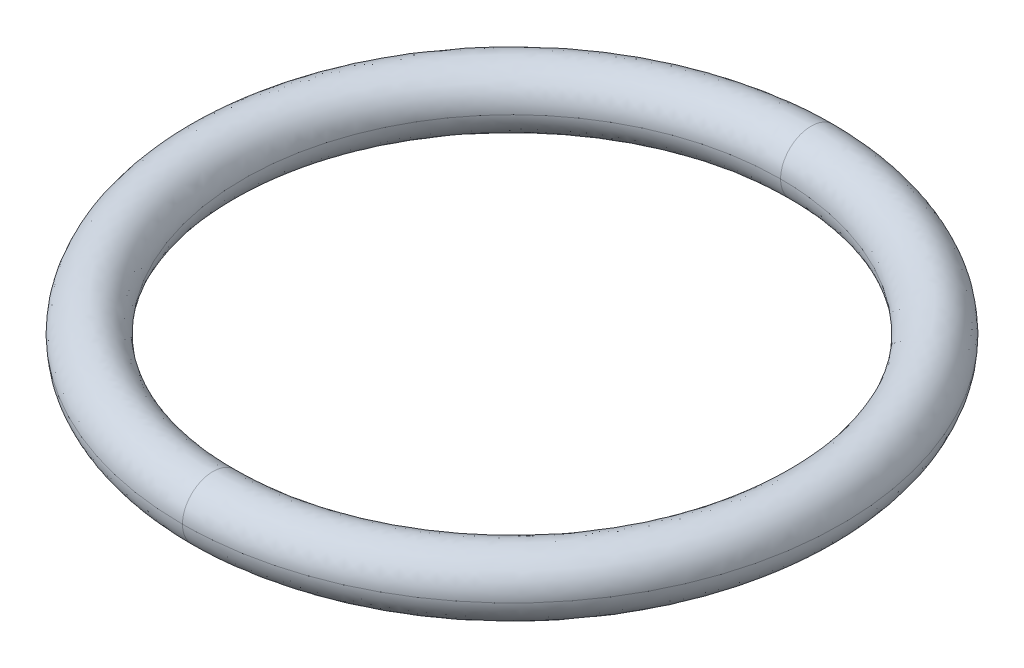
ISO-10303-21;
HEADER;
FILE_DESCRIPTION(('STEP AP214'),'2;1');
FILE_NAME('part.step','',(''),(''),'','','');
FILE_SCHEMA(('AUTOMOTIVE_DESIGN { 1 0 10303 214 1 1 1 1 }'));
ENDSEC;
DATA;
#1=APPLICATION_CONTEXT('core data for automotive mechanical design processes');
#2=APPLICATION_PROTOCOL_DEFINITION('international standard','automotive_design',2000,#1);
#3=PRODUCT_CONTEXT('',#1,'mechanical');
#4=PRODUCT('Part','Part','',(#3));
#5=PRODUCT_RELATED_PRODUCT_CATEGORY('part','',(#4));
#6=PRODUCT_DEFINITION_FORMATION('','',#4);
#7=PRODUCT_DEFINITION_CONTEXT('part definition',#1,'design');
#8=PRODUCT_DEFINITION('design','',#6,#7);
#9=PRODUCT_DEFINITION_SHAPE('','',#8);
#10=(LENGTH_UNIT() NAMED_UNIT(*) SI_UNIT(.MILLI.,.METRE.));
#11=(NAMED_UNIT(*) PLANE_ANGLE_UNIT() SI_UNIT($,.RADIAN.));
#12=(NAMED_UNIT(*) SI_UNIT($,.STERADIAN.) SOLID_ANGLE_UNIT());
#13=UNCERTAINTY_MEASURE_WITH_UNIT(LENGTH_MEASURE(1.E-05),#10,'distance_accuracy_value','');
#14=(GEOMETRIC_REPRESENTATION_CONTEXT(3) GLOBAL_UNCERTAINTY_ASSIGNED_CONTEXT((#13)) GLOBAL_UNIT_ASSIGNED_CONTEXT((#10,
#11,#12)) REPRESENTATION_CONTEXT('',''));
#15=CARTESIAN_POINT('',(0.,0.,0.));
#16=DIRECTION('',(0.,0.,1.));
#17=DIRECTION('',(1.,0.,0.));
#18=AXIS2_PLACEMENT_3D('',#15,#16,#17);
#19=CARTESIAN_POINT('',(0.,0.7145072324,-8.581234552));
#20=CARTESIAN_POINT('',(17.162469104,0.7145072324,-8.581234552));
#21=CARTESIAN_POINT('',(17.162469104,0.7145072324,8.581234552));
#22=CARTESIAN_POINT('',(0.,0.7145072324,8.581234552));
#23=CARTESIAN_POINT('',(0.,1.2147073496,-8.63142198020001));
#24=CARTESIAN_POINT('',(17.262843935,1.2147073496,-8.6314219802));
#25=CARTESIAN_POINT('',(17.262843935,1.2147073496,8.6314219802));
#26=CARTESIAN_POINT('',(0.,1.2147073496,8.63142198020001));
#27=CARTESIAN_POINT('',(0.,1.5875,-8.294161593));
#28=CARTESIAN_POINT('',(16.5883231606,1.5875,-8.29416159300001));
#29=CARTESIAN_POINT('',(16.5883231606,1.5875,8.29416159300001));
#30=CARTESIAN_POINT('',(0.,1.5875,8.294161593));
#31=CARTESIAN_POINT('',(0.,1.5875,-7.79145));
#32=CARTESIAN_POINT('',(15.5829,1.5875,-7.79145000000001));
#33=CARTESIAN_POINT('',(15.5829,1.5875,7.79145000000001));
#34=CARTESIAN_POINT('',(0.,1.5875,7.79145));
#35=CARTESIAN_POINT('',(0.,1.5875,-7.288738407));
#36=CARTESIAN_POINT('',(14.5774768394,1.5875,-7.28873840700001));
#37=CARTESIAN_POINT('',(14.5774768394,1.5875,7.28873840700001));
#38=CARTESIAN_POINT('',(0.,1.5875,7.288738407));
#39=CARTESIAN_POINT('',(0.,1.2147073496,-6.9514780198));
#40=CARTESIAN_POINT('',(13.902956065,1.2147073496,-6.95147801979999));
#41=CARTESIAN_POINT('',(13.902956065,1.2147073496,6.95147801979999));
#42=CARTESIAN_POINT('',(0.,1.2147073496,6.9514780198));
#43=CARTESIAN_POINT('',(0.,0.7145072324,-7.001665448));
#44=CARTESIAN_POINT('',(14.003330896,0.7145072324,-7.001665448));
#45=CARTESIAN_POINT('',(14.003330896,0.7145072324,7.001665448));
#46=CARTESIAN_POINT('',(0.,0.7145072324,7.001665448));
#47=(BOUNDED_SURFACE() B_SPLINE_SURFACE(3,3,((#19,#20,#21,#22),(#23,#24,#25,#26),(#27,#28,#29,
#30),(#31,#32,#33,#34),(#35,#36,#37,#38),(#39,#40,#41,#42),(#43,#44,#45,#46)),.UNSPECIFIED.,.F.,
.F.,.F.) B_SPLINE_SURFACE_WITH_KNOTS((4,3,4),(4,4),(0.,0.5,1.),(0.,1.),
.UNSPECIFIED.) GEOMETRIC_REPRESENTATION_ITEM() RATIONAL_B_SPLINE_SURFACE(((1.,0.333333333333333,
0.333333333333333,1.),(0.780588314885163,0.260196104961721,0.260196104961721,0.780588314885163),
(0.780588314885163,0.260196104961721,0.260196104961721,0.780588314885163),(1.,0.333333333333333,
0.333333333333333,1.),(0.780588314885163,0.260196104961721,0.260196104961721,0.780588314885163),
(0.780588314885163,0.260196104961721,0.260196104961721,0.780588314885163),(1.,0.333333333333333,
0.333333333333333,1.))) REPRESENTATION_ITEM('') SURFACE());
#48=CARTESIAN_POINT('',(0.,0.793749992404796,6.99770000215657));
#49=CARTESIAN_POINT('',(13.9954000081357,0.793749992404796,6.99770000215657));
#50=CARTESIAN_POINT('',(13.9954000081357,0.793749992404796,-6.99770000215657));
#51=CARTESIAN_POINT('',(0.,0.793749992404796,-6.99770000215657));
#52=(BOUNDED_CURVE() B_SPLINE_CURVE(3,(#48,#49,#50,#51),.UNSPECIFIED.,.F.,
.F.) B_SPLINE_CURVE_WITH_KNOTS((4,4),(0.,1.),
.UNSPECIFIED.) CURVE() GEOMETRIC_REPRESENTATION_ITEM() RATIONAL_B_SPLINE_CURVE((0.959415081908988,
0.319805027302996,0.319805027302996,0.959415081908988)) REPRESENTATION_ITEM(''));
#53=CARTESIAN_POINT('',(0.,0.79375,6.99770000215657));
#54=VERTEX_POINT('',#53);
#55=CARTESIAN_POINT('',(0.,0.79375,-6.99770000215657));
#56=VERTEX_POINT('',#55);
#57=EDGE_CURVE('E74',#54,#56,#52,.T.);
#58=CARTESIAN_POINT('',(0.,0.7145072324,8.581234552));
#59=CARTESIAN_POINT('',(0.,1.2147073496,8.63142198020001));
#60=CARTESIAN_POINT('',(0.,1.5875,8.294161593));
#61=CARTESIAN_POINT('',(0.,1.5875,7.79145));
#62=CARTESIAN_POINT('',(0.,1.5875,7.288738407));
#63=CARTESIAN_POINT('',(0.,1.2147073496,6.9514780198));
#64=CARTESIAN_POINT('',(0.,0.7145072324,7.001665448));
#65=(BOUNDED_CURVE() B_SPLINE_CURVE(3,(#58,#59,#60,#61,#62,#63,#64),.UNSPECIFIED.,.F.,
.F.) B_SPLINE_CURVE_WITH_KNOTS((4,3,4),(0.,0.5,1.),
.UNSPECIFIED.) CURVE() GEOMETRIC_REPRESENTATION_ITEM() RATIONAL_B_SPLINE_CURVE((1.,
0.780588314885163,0.780588314885163,1.,0.780588314885163,0.780588314885163,1.)) REPRESENTATION_ITEM(''));
#66=CARTESIAN_POINT('',(0.,0.79375,8.58519999784343));
#67=VERTEX_POINT('',#66);
#68=EDGE_CURVE('E39',#67,#54,#65,.T.);
#69=CARTESIAN_POINT('',(0.,0.793749992404796,-8.58519999784343));
#70=CARTESIAN_POINT('',(17.1703999918643,0.793749992404796,-8.58519999784343));
#71=CARTESIAN_POINT('',(17.1703999918643,0.793749992404796,8.58519999784343));
#72=CARTESIAN_POINT('',(0.,0.793749992404796,8.58519999784343));
#73=(BOUNDED_CURVE() B_SPLINE_CURVE(3,(#69,#70,#71,#72),.UNSPECIFIED.,.F.,
.F.) B_SPLINE_CURVE_WITH_KNOTS((4,4),(0.,1.),
.UNSPECIFIED.) CURVE() GEOMETRIC_REPRESENTATION_ITEM() RATIONAL_B_SPLINE_CURVE((0.959415081908988,
0.319805027302996,0.319805027302996,0.959415081908988)) REPRESENTATION_ITEM(''));
#74=CARTESIAN_POINT('',(0.,0.79375,-8.58519999784343));
#75=VERTEX_POINT('',#74);
#76=EDGE_CURVE('E44',#75,#67,#73,.T.);
#77=CARTESIAN_POINT('',(0.,0.7145072324,-7.001665448));
#78=CARTESIAN_POINT('',(0.,1.2147073496,-6.9514780198));
#79=CARTESIAN_POINT('',(0.,1.5875,-7.288738407));
#80=CARTESIAN_POINT('',(0.,1.5875,-7.79145));
#81=CARTESIAN_POINT('',(0.,1.5875,-8.294161593));
#82=CARTESIAN_POINT('',(0.,1.2147073496,-8.63142198020001));
#83=CARTESIAN_POINT('',(0.,0.7145072324,-8.581234552));
#84=(BOUNDED_CURVE() B_SPLINE_CURVE(3,(#77,#78,#79,#80,#81,#82,#83),.UNSPECIFIED.,.F.,
.F.) B_SPLINE_CURVE_WITH_KNOTS((4,3,4),(0.,0.5,1.),
.UNSPECIFIED.) CURVE() GEOMETRIC_REPRESENTATION_ITEM() RATIONAL_B_SPLINE_CURVE((1.,
0.780588314885163,0.780588314885163,1.,0.780588314885163,0.780588314885163,1.)) REPRESENTATION_ITEM(''));
#85=EDGE_CURVE('E68',#56,#75,#84,.T.);
#86=ORIENTED_EDGE('',*,*,#57,.F.);
#87=ORIENTED_EDGE('',*,*,#68,.F.);
#88=ORIENTED_EDGE('',*,*,#76,.F.);
#89=ORIENTED_EDGE('',*,*,#85,.F.);
#90=EDGE_LOOP('',(#86,#87,#88,#89));
#91=FACE_BOUND('',#90,.T.);
#92=ADVANCED_FACE('F17',(#91),#47,.T.);
#93=CARTESIAN_POINT('',(0.,0.8729927676,-7.001665448));
#94=CARTESIAN_POINT('',(14.003330896,0.872992767599999,-7.001665448));
#95=CARTESIAN_POINT('',(14.003330896,0.872992767599999,7.001665448));
#96=CARTESIAN_POINT('',(0.,0.8729927676,7.001665448));
#97=CARTESIAN_POINT('',(0.,0.3727926504,-6.9514780198));
#98=CARTESIAN_POINT('',(13.902956065,0.3727926504,-6.95147801979999));
#99=CARTESIAN_POINT('',(13.902956065,0.3727926504,6.95147801979999));
#100=CARTESIAN_POINT('',(0.,0.3727926504,6.9514780198));
#101=CARTESIAN_POINT('',(0.,0.,-7.288738407));
#102=CARTESIAN_POINT('',(14.5774768394,0.,-7.28873840700001));
#103=CARTESIAN_POINT('',(14.5774768394,0.,7.28873840700001));
#104=CARTESIAN_POINT('',(0.,0.,7.288738407));
#105=CARTESIAN_POINT('',(0.,0.,-7.79145));
#106=CARTESIAN_POINT('',(15.5829,0.,-7.79145000000001));
#107=CARTESIAN_POINT('',(15.5829,0.,7.79145000000001));
#108=CARTESIAN_POINT('',(0.,0.,7.79145));
#109=CARTESIAN_POINT('',(0.,0.,-8.294161593));
#110=CARTESIAN_POINT('',(16.5883231606,0.,-8.29416159300001));
#111=CARTESIAN_POINT('',(16.5883231606,0.,8.29416159300001));
#112=CARTESIAN_POINT('',(0.,0.,8.294161593));
#113=CARTESIAN_POINT('',(0.,0.3727926504,-8.63142198020001));
#114=CARTESIAN_POINT('',(17.262843935,0.3727926504,-8.6314219802));
#115=CARTESIAN_POINT('',(17.262843935,0.3727926504,8.6314219802));
#116=CARTESIAN_POINT('',(0.,0.3727926504,8.63142198020001));
#117=CARTESIAN_POINT('',(0.,0.8729927676,-8.581234552));
#118=CARTESIAN_POINT('',(17.162469104,0.872992767599999,-8.581234552));
#119=CARTESIAN_POINT('',(17.162469104,0.872992767599999,8.581234552));
#120=CARTESIAN_POINT('',(0.,0.8729927676,8.581234552));
#121=(BOUNDED_SURFACE() B_SPLINE_SURFACE(3,3,((#93,#94,#95,#96),(#97,#98,#99,#100),(#101,#102,
#103,#104),(#105,#106,#107,#108),(#109,#110,#111,#112),(#113,#114,#115,#116),(#117,#118,#119,
#120)),.UNSPECIFIED.,.F.,.F.,.F.) B_SPLINE_SURFACE_WITH_KNOTS((4,3,4),(4,4),(0.,0.5,1.),(0.,1.),
.UNSPECIFIED.) GEOMETRIC_REPRESENTATION_ITEM() RATIONAL_B_SPLINE_SURFACE(((1.,0.333333333333333,
0.333333333333333,1.),(0.780588314885163,0.260196104961721,0.260196104961721,0.780588314885163),
(0.780588314885163,0.260196104961721,0.260196104961721,0.780588314885163),(1.,0.333333333333333,
0.333333333333333,1.),(0.780588314885163,0.260196104961721,0.260196104961721,0.780588314885163),
(0.780588314885163,0.260196104961721,0.260196104961721,0.780588314885163),(1.,0.333333333333333,
0.333333333333333,1.))) REPRESENTATION_ITEM('') SURFACE());
#122=CARTESIAN_POINT('',(0.,0.8729927676,7.001665448));
#123=CARTESIAN_POINT('',(0.,0.3727926504,6.9514780198));
#124=CARTESIAN_POINT('',(0.,0.,7.288738407));
#125=CARTESIAN_POINT('',(0.,0.,7.79145));
#126=CARTESIAN_POINT('',(0.,0.,8.294161593));
#127=CARTESIAN_POINT('',(0.,0.3727926504,8.63142198020001));
#128=CARTESIAN_POINT('',(0.,0.8729927676,8.581234552));
#129=(BOUNDED_CURVE() B_SPLINE_CURVE(3,(#122,#123,#124,#125,#126,#127,#128),.UNSPECIFIED.,.F.,
.F.) B_SPLINE_CURVE_WITH_KNOTS((4,3,4),(0.,0.5,1.),
.UNSPECIFIED.) CURVE() GEOMETRIC_REPRESENTATION_ITEM() RATIONAL_B_SPLINE_CURVE((1.,
0.780588314885163,0.780588314885163,1.,0.780588314885163,0.780588314885163,1.)) REPRESENTATION_ITEM(''));
#130=EDGE_CURVE('E78',#54,#67,#129,.T.);
#131=CARTESIAN_POINT('',(0.,0.8729927676,-7.001665448));
#132=CARTESIAN_POINT('',(0.,0.3727926504,-6.9514780198));
#133=CARTESIAN_POINT('',(0.,0.,-7.288738407));
#134=CARTESIAN_POINT('',(0.,0.,-7.79145));
#135=CARTESIAN_POINT('',(0.,0.,-8.294161593));
#136=CARTESIAN_POINT('',(0.,0.3727926504,-8.63142198020001));
#137=CARTESIAN_POINT('',(0.,0.8729927676,-8.581234552));
#138=(BOUNDED_CURVE() B_SPLINE_CURVE(3,(#131,#132,#133,#134,#135,#136,#137),.UNSPECIFIED.,.F.,
.F.) B_SPLINE_CURVE_WITH_KNOTS((4,3,4),(0.,0.5,1.),
.UNSPECIFIED.) CURVE() GEOMETRIC_REPRESENTATION_ITEM() RATIONAL_B_SPLINE_CURVE((1.,
0.780588314885163,0.780588314885163,1.,0.780588314885163,0.780588314885163,1.)) REPRESENTATION_ITEM(''));
#139=EDGE_CURVE('E50',#56,#75,#138,.T.);
#140=ORIENTED_EDGE('',*,*,#130,.F.);
#141=ORIENTED_EDGE('',*,*,#57,.T.);
#142=ORIENTED_EDGE('',*,*,#139,.T.);
#143=ORIENTED_EDGE('',*,*,#76,.T.);
#144=EDGE_LOOP('',(#140,#141,#142,#143));
#145=FACE_BOUND('',#144,.T.);
#146=ADVANCED_FACE('F82',(#145),#121,.T.);
#147=CARTESIAN_POINT('',(0.,0.7145072324,8.581234552));
#148=CARTESIAN_POINT('',(-17.162469104,0.7145072324,8.581234552));
#149=CARTESIAN_POINT('',(-17.162469104,0.7145072324,-8.581234552));
#150=CARTESIAN_POINT('',(0.,0.7145072324,-8.581234552));
#151=CARTESIAN_POINT('',(0.,1.2147073496,8.63142198020001));
#152=CARTESIAN_POINT('',(-17.262843935,1.2147073496,8.6314219802));
#153=CARTESIAN_POINT('',(-17.262843935,1.2147073496,-8.6314219802));
#154=CARTESIAN_POINT('',(0.,1.2147073496,-8.63142198020001));
#155=CARTESIAN_POINT('',(0.,1.5875,8.294161593));
#156=CARTESIAN_POINT('',(-16.5883231606,1.5875,8.29416159300001));
#157=CARTESIAN_POINT('',(-16.5883231606,1.5875,-8.29416159300001));
#158=CARTESIAN_POINT('',(0.,1.5875,-8.294161593));
#159=CARTESIAN_POINT('',(0.,1.5875,7.79145));
#160=CARTESIAN_POINT('',(-15.5829,1.5875,7.79145000000001));
#161=CARTESIAN_POINT('',(-15.5829,1.5875,-7.79145000000001));
#162=CARTESIAN_POINT('',(0.,1.5875,-7.79145));
#163=CARTESIAN_POINT('',(0.,1.5875,7.288738407));
#164=CARTESIAN_POINT('',(-14.5774768394,1.5875,7.28873840700001));
#165=CARTESIAN_POINT('',(-14.5774768394,1.5875,-7.28873840700001));
#166=CARTESIAN_POINT('',(0.,1.5875,-7.288738407));
#167=CARTESIAN_POINT('',(0.,1.2147073496,6.9514780198));
#168=CARTESIAN_POINT('',(-13.902956065,1.2147073496,6.95147801979999));
#169=CARTESIAN_POINT('',(-13.902956065,1.2147073496,-6.95147801979999));
#170=CARTESIAN_POINT('',(0.,1.2147073496,-6.9514780198));
#171=CARTESIAN_POINT('',(0.,0.7145072324,7.001665448));
#172=CARTESIAN_POINT('',(-14.003330896,0.7145072324,7.001665448));
#173=CARTESIAN_POINT('',(-14.003330896,0.7145072324,-7.001665448));
#174=CARTESIAN_POINT('',(0.,0.7145072324,-7.001665448));
#175=(BOUNDED_SURFACE() B_SPLINE_SURFACE(3,3,((#147,#148,#149,#150),(#151,#152,#153,#154),(#155,
#156,#157,#158),(#159,#160,#161,#162),(#163,#164,#165,#166),(#167,#168,#169,#170),(#171,#172,
#173,#174)),.UNSPECIFIED.,.F.,.F.,.F.) B_SPLINE_SURFACE_WITH_KNOTS((4,3,4),(4,4),(0.,0.5,1.),
(0.,1.),.UNSPECIFIED.) GEOMETRIC_REPRESENTATION_ITEM() RATIONAL_B_SPLINE_SURFACE(((1.,
0.333333333333333,0.333333333333333,1.),(0.780588314885163,0.260196104961721,0.260196104961721,
0.780588314885163),(0.780588314885163,0.260196104961721,0.260196104961721,0.780588314885163),
(1.,0.333333333333333,0.333333333333333,1.),(0.780588314885163,0.260196104961721,
0.260196104961721,0.780588314885163),(0.780588314885163,0.260196104961721,0.260196104961721,
0.780588314885163),(1.,0.333333333333333,0.333333333333333,1.))) REPRESENTATION_ITEM('') SURFACE());
#176=CARTESIAN_POINT('',(0.,0.793749992404796,-6.99770000215657));
#177=CARTESIAN_POINT('',(-13.9954000081357,0.793749992404796,-6.99770000215657));
#178=CARTESIAN_POINT('',(-13.9954000081357,0.793749992404796,6.99770000215657));
#179=CARTESIAN_POINT('',(0.,0.793749992404796,6.99770000215657));
#180=(BOUNDED_CURVE() B_SPLINE_CURVE(3,(#176,#177,#178,#179),.UNSPECIFIED.,.F.,
.F.) B_SPLINE_CURVE_WITH_KNOTS((4,4),(0.,1.),
.UNSPECIFIED.) CURVE() GEOMETRIC_REPRESENTATION_ITEM() RATIONAL_B_SPLINE_CURVE((0.959415081908988,
0.319805027302996,0.319805027302996,0.959415081908988)) REPRESENTATION_ITEM(''));
#181=EDGE_CURVE('E11',#56,#54,#180,.T.);
#182=CARTESIAN_POINT('',(0.,0.793749992404796,8.58519999784343));
#183=CARTESIAN_POINT('',(-17.1703999918643,0.793749992404796,8.58519999784343));
#184=CARTESIAN_POINT('',(-17.1703999918643,0.793749992404796,-8.58519999784343));
#185=CARTESIAN_POINT('',(0.,0.793749992404796,-8.58519999784343));
#186=(BOUNDED_CURVE() B_SPLINE_CURVE(3,(#182,#183,#184,#185),.UNSPECIFIED.,.F.,
.F.) B_SPLINE_CURVE_WITH_KNOTS((4,4),(0.,1.),
.UNSPECIFIED.) CURVE() GEOMETRIC_REPRESENTATION_ITEM() RATIONAL_B_SPLINE_CURVE((0.959415081908988,
0.319805027302996,0.319805027302996,0.959415081908988)) REPRESENTATION_ITEM(''));
#187=EDGE_CURVE('E31',#67,#75,#186,.T.);
#188=ORIENTED_EDGE('',*,*,#181,.F.);
#189=ORIENTED_EDGE('',*,*,#85,.T.);
#190=ORIENTED_EDGE('',*,*,#187,.F.);
#191=ORIENTED_EDGE('',*,*,#68,.T.);
#192=EDGE_LOOP('',(#188,#189,#190,#191));
#193=FACE_BOUND('',#192,.T.);
#194=ADVANCED_FACE('F67',(#193),#175,.T.);
#195=CARTESIAN_POINT('',(0.,0.8729927676,7.001665448));
#196=CARTESIAN_POINT('',(-14.003330896,0.872992767599999,7.001665448));
#197=CARTESIAN_POINT('',(-14.003330896,0.872992767599999,-7.001665448));
#198=CARTESIAN_POINT('',(0.,0.8729927676,-7.001665448));
#199=CARTESIAN_POINT('',(0.,0.3727926504,6.9514780198));
#200=CARTESIAN_POINT('',(-13.902956065,0.3727926504,6.95147801979999));
#201=CARTESIAN_POINT('',(-13.902956065,0.3727926504,-6.95147801979999));
#202=CARTESIAN_POINT('',(0.,0.3727926504,-6.9514780198));
#203=CARTESIAN_POINT('',(0.,0.,7.288738407));
#204=CARTESIAN_POINT('',(-14.5774768394,0.,7.28873840700001));
#205=CARTESIAN_POINT('',(-14.5774768394,0.,-7.28873840700001));
#206=CARTESIAN_POINT('',(0.,0.,-7.288738407));
#207=CARTESIAN_POINT('',(0.,0.,7.79145));
#208=CARTESIAN_POINT('',(-15.5829,0.,7.79145000000001));
#209=CARTESIAN_POINT('',(-15.5829,0.,-7.79145000000001));
#210=CARTESIAN_POINT('',(0.,0.,-7.79145));
#211=CARTESIAN_POINT('',(0.,0.,8.294161593));
#212=CARTESIAN_POINT('',(-16.5883231606,0.,8.29416159300001));
#213=CARTESIAN_POINT('',(-16.5883231606,0.,-8.29416159300001));
#214=CARTESIAN_POINT('',(0.,0.,-8.294161593));
#215=CARTESIAN_POINT('',(0.,0.3727926504,8.63142198020001));
#216=CARTESIAN_POINT('',(-17.262843935,0.3727926504,8.6314219802));
#217=CARTESIAN_POINT('',(-17.262843935,0.3727926504,-8.6314219802));
#218=CARTESIAN_POINT('',(0.,0.3727926504,-8.63142198020001));
#219=CARTESIAN_POINT('',(0.,0.8729927676,8.581234552));
#220=CARTESIAN_POINT('',(-17.162469104,0.872992767599999,8.581234552));
#221=CARTESIAN_POINT('',(-17.162469104,0.872992767599999,-8.581234552));
#222=CARTESIAN_POINT('',(0.,0.8729927676,-8.581234552));
#223=(BOUNDED_SURFACE() B_SPLINE_SURFACE(3,3,((#195,#196,#197,#198),(#199,#200,#201,#202),(#203,
#204,#205,#206),(#207,#208,#209,#210),(#211,#212,#213,#214),(#215,#216,#217,#218),(#219,#220,
#221,#222)),.UNSPECIFIED.,.F.,.F.,.F.) B_SPLINE_SURFACE_WITH_KNOTS((4,3,4),(4,4),(0.,0.5,1.),
(0.,1.),.UNSPECIFIED.) GEOMETRIC_REPRESENTATION_ITEM() RATIONAL_B_SPLINE_SURFACE(((1.,
0.333333333333333,0.333333333333333,1.),(0.780588314885163,0.260196104961721,0.260196104961721,
0.780588314885163),(0.780588314885163,0.260196104961721,0.260196104961721,0.780588314885163),
(1.,0.333333333333333,0.333333333333333,1.),(0.780588314885163,0.260196104961721,
0.260196104961721,0.780588314885163),(0.780588314885163,0.260196104961721,0.260196104961721,
0.780588314885163),(1.,0.333333333333333,0.333333333333333,1.))) REPRESENTATION_ITEM('') SURFACE());
#224=ORIENTED_EDGE('',*,*,#139,.F.);
#225=ORIENTED_EDGE('',*,*,#181,.T.);
#226=ORIENTED_EDGE('',*,*,#130,.T.);
#227=ORIENTED_EDGE('',*,*,#187,.T.);
#228=EDGE_LOOP('',(#224,#225,#226,#227));
#229=FACE_BOUND('',#228,.T.);
#230=ADVANCED_FACE('F53',(#229),#223,.T.);
#231=CLOSED_SHELL('',(#92,#146,#194,#230));
#232=MANIFOLD_SOLID_BREP('B1',#231);
#233=ADVANCED_BREP_SHAPE_REPRESENTATION('',(#18,#232),#14);
#234=SHAPE_DEFINITION_REPRESENTATION(#9,#233);
ENDSEC;
END-ISO-10303-21;
